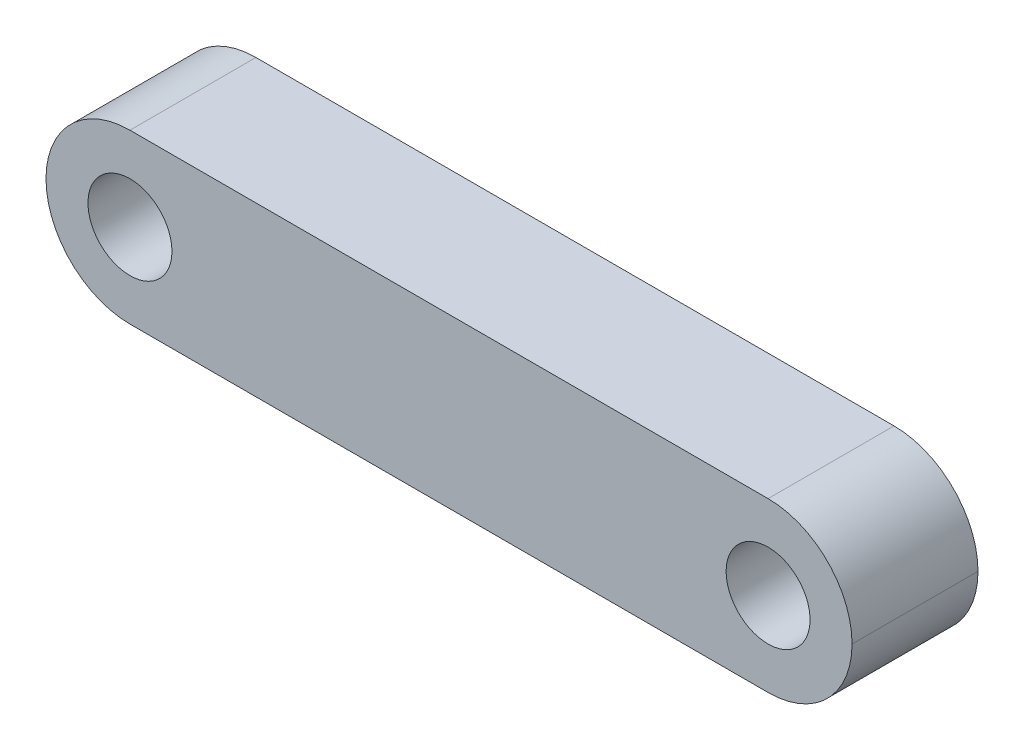
ISO-10303-21;
HEADER;
FILE_DESCRIPTION(('STEP AP214'),'2;1');
FILE_NAME('part.step','',(''),(''),'','','');
FILE_SCHEMA(('AUTOMOTIVE_DESIGN { 1 0 10303 214 1 1 1 1 }'));
ENDSEC;
DATA;
#1=APPLICATION_CONTEXT('core data for automotive mechanical design processes');
#2=APPLICATION_PROTOCOL_DEFINITION('international standard','automotive_design',2000,#1);
#3=PRODUCT_CONTEXT('',#1,'mechanical');
#4=PRODUCT('Part','Part','',(#3));
#5=PRODUCT_RELATED_PRODUCT_CATEGORY('part','',(#4));
#6=PRODUCT_DEFINITION_FORMATION('','',#4);
#7=PRODUCT_DEFINITION_CONTEXT('part definition',#1,'design');
#8=PRODUCT_DEFINITION('design','',#6,#7);
#9=PRODUCT_DEFINITION_SHAPE('','',#8);
#10=(LENGTH_UNIT() NAMED_UNIT(*) SI_UNIT(.MILLI.,.METRE.));
#11=(NAMED_UNIT(*) PLANE_ANGLE_UNIT() SI_UNIT($,.RADIAN.));
#12=(NAMED_UNIT(*) SI_UNIT($,.STERADIAN.) SOLID_ANGLE_UNIT());
#13=UNCERTAINTY_MEASURE_WITH_UNIT(LENGTH_MEASURE(1.E-05),#10,'distance_accuracy_value','');
#14=(GEOMETRIC_REPRESENTATION_CONTEXT(3) GLOBAL_UNCERTAINTY_ASSIGNED_CONTEXT((#13)) GLOBAL_UNIT_ASSIGNED_CONTEXT((#10,
#11,#12)) REPRESENTATION_CONTEXT('',''));
#15=CARTESIAN_POINT('',(0.,0.,0.));
#16=DIRECTION('',(0.,0.,1.));
#17=DIRECTION('',(1.,0.,0.));
#18=AXIS2_PLACEMENT_3D('',#15,#16,#17);
#19=CARTESIAN_POINT('',(0.,0.,15.));
#20=DIRECTION('',(0.,0.,1.));
#21=DIRECTION('',(1.,0.,0.));
#22=AXIS2_PLACEMENT_3D('',#19,#20,#21);
#23=PLANE('',#22);
#24=CARTESIAN_POINT('',(-76.,0.,15.));
#25=DIRECTION('',(0.,0.,1.));
#26=DIRECTION('',(1.,0.,0.));
#27=AXIS2_PLACEMENT_3D('',#24,#25,#26);
#28=CIRCLE('',#27,10.);
#29=CARTESIAN_POINT('',(-66.,0.,15.));
#30=VERTEX_POINT('',#29);
#31=EDGE_CURVE('E119',#30,#30,#28,.T.);
#32=ORIENTED_EDGE('',*,*,#31,.F.);
#33=EDGE_LOOP('',(#32));
#34=FACE_BOUND('',#33,.T.);
#35=CARTESIAN_POINT('',(-76.,0.,15.));
#36=DIRECTION('',(0.,0.,1.));
#37=DIRECTION('',(1.,0.,0.));
#38=AXIS2_PLACEMENT_3D('',#35,#36,#37);
#39=CIRCLE('',#38,20.);
#40=CARTESIAN_POINT('',(-76.,20.,15.));
#41=VERTEX_POINT('',#40);
#42=CARTESIAN_POINT('',(-96.,0.,15.));
#43=VERTEX_POINT('',#42);
#44=EDGE_CURVE('E49',#41,#43,#39,.T.);
#45=ORIENTED_EDGE('',*,*,#44,.T.);
#46=CARTESIAN_POINT('',(-76.,0.,15.));
#47=DIRECTION('',(0.,0.,1.));
#48=DIRECTION('',(1.,0.,0.));
#49=AXIS2_PLACEMENT_3D('',#46,#47,#48);
#50=CIRCLE('',#49,20.);
#51=CARTESIAN_POINT('',(-76.,-20.,15.));
#52=VERTEX_POINT('',#51);
#53=EDGE_CURVE('E131',#43,#52,#50,.T.);
#54=ORIENTED_EDGE('',*,*,#53,.T.);
#55=DIRECTION('',(1.,0.,0.));
#56=VECTOR('',#55,1.);
#57=CARTESIAN_POINT('',(-96.,-20.,15.));
#58=LINE('',#57,#56);
#59=CARTESIAN_POINT('',(76.,-20.,15.));
#60=VERTEX_POINT('',#59);
#61=EDGE_CURVE('E107',#52,#60,#58,.T.);
#62=ORIENTED_EDGE('',*,*,#61,.T.);
#63=CARTESIAN_POINT('',(76.,0.,15.));
#64=DIRECTION('',(0.,0.,1.));
#65=DIRECTION('',(1.,0.,0.));
#66=AXIS2_PLACEMENT_3D('',#63,#64,#65);
#67=CIRCLE('',#66,20.);
#68=CARTESIAN_POINT('',(96.,0.,15.));
#69=VERTEX_POINT('',#68);
#70=EDGE_CURVE('E128',#60,#69,#67,.T.);
#71=ORIENTED_EDGE('',*,*,#70,.T.);
#72=CARTESIAN_POINT('',(76.,0.,15.));
#73=DIRECTION('',(0.,0.,1.));
#74=DIRECTION('',(1.,0.,0.));
#75=AXIS2_PLACEMENT_3D('',#72,#73,#74);
#76=CIRCLE('',#75,20.);
#77=CARTESIAN_POINT('',(76.,20.,15.));
#78=VERTEX_POINT('',#77);
#79=EDGE_CURVE('E96',#69,#78,#76,.T.);
#80=ORIENTED_EDGE('',*,*,#79,.T.);
#81=DIRECTION('',(-1.,0.,0.));
#82=VECTOR('',#81,1.);
#83=CARTESIAN_POINT('',(-96.,20.,15.));
#84=LINE('',#83,#82);
#85=EDGE_CURVE('E115',#78,#41,#84,.T.);
#86=ORIENTED_EDGE('',*,*,#85,.T.);
#87=EDGE_LOOP('',(#45,#54,#62,#71,#80,#86));
#88=FACE_BOUND('',#87,.T.);
#89=CARTESIAN_POINT('',(76.,0.,15.));
#90=DIRECTION('',(0.,0.,1.));
#91=DIRECTION('',(-1.,0.,0.));
#92=AXIS2_PLACEMENT_3D('',#89,#90,#91);
#93=CIRCLE('',#92,10.);
#94=CARTESIAN_POINT('',(66.,0.,15.));
#95=VERTEX_POINT('',#94);
#96=EDGE_CURVE('E135',#95,#95,#93,.T.);
#97=ORIENTED_EDGE('',*,*,#96,.F.);
#98=EDGE_LOOP('',(#97));
#99=FACE_BOUND('',#98,.T.);
#100=ADVANCED_FACE('F32',(#34,#88,#99),#23,.T.);
#101=CARTESIAN_POINT('',(0.,0.,-15.));
#102=DIRECTION('',(0.,0.,1.));
#103=DIRECTION('',(1.,0.,0.));
#104=AXIS2_PLACEMENT_3D('',#101,#102,#103);
#105=PLANE('',#104);
#106=DIRECTION('',(1.,0.,0.));
#107=VECTOR('',#106,1.);
#108=CARTESIAN_POINT('',(-96.,-20.,-15.));
#109=LINE('',#108,#107);
#110=CARTESIAN_POINT('',(-76.,-20.,-15.));
#111=VERTEX_POINT('',#110);
#112=CARTESIAN_POINT('',(76.,-20.,-15.));
#113=VERTEX_POINT('',#112);
#114=EDGE_CURVE('E104',#111,#113,#109,.T.);
#115=ORIENTED_EDGE('',*,*,#114,.F.);
#116=CARTESIAN_POINT('',(-76.,0.,-15.));
#117=DIRECTION('',(0.,0.,1.));
#118=DIRECTION('',(1.,0.,0.));
#119=AXIS2_PLACEMENT_3D('',#116,#117,#118);
#120=CIRCLE('',#119,20.);
#121=CARTESIAN_POINT('',(-96.,0.,-15.));
#122=VERTEX_POINT('',#121);
#123=EDGE_CURVE('E87',#111,#122,#120,.F.);
#124=ORIENTED_EDGE('',*,*,#123,.T.);
#125=CARTESIAN_POINT('',(-76.,0.,-15.));
#126=DIRECTION('',(0.,0.,1.));
#127=DIRECTION('',(1.,0.,0.));
#128=AXIS2_PLACEMENT_3D('',#125,#126,#127);
#129=CIRCLE('',#128,20.);
#130=CARTESIAN_POINT('',(-76.,20.,-15.));
#131=VERTEX_POINT('',#130);
#132=EDGE_CURVE('E97',#122,#131,#129,.F.);
#133=ORIENTED_EDGE('',*,*,#132,.T.);
#134=DIRECTION('',(-1.,0.,0.));
#135=VECTOR('',#134,1.);
#136=CARTESIAN_POINT('',(-96.,20.,-15.));
#137=LINE('',#136,#135);
#138=CARTESIAN_POINT('',(76.,20.,-15.));
#139=VERTEX_POINT('',#138);
#140=EDGE_CURVE('E116',#139,#131,#137,.T.);
#141=ORIENTED_EDGE('',*,*,#140,.F.);
#142=CARTESIAN_POINT('',(76.,0.,-15.));
#143=DIRECTION('',(0.,0.,1.));
#144=DIRECTION('',(1.,0.,0.));
#145=AXIS2_PLACEMENT_3D('',#142,#143,#144);
#146=CIRCLE('',#145,20.);
#147=CARTESIAN_POINT('',(96.,0.,-15.));
#148=VERTEX_POINT('',#147);
#149=EDGE_CURVE('E108',#139,#148,#146,.F.);
#150=ORIENTED_EDGE('',*,*,#149,.T.);
#151=CARTESIAN_POINT('',(76.,0.,-15.));
#152=DIRECTION('',(0.,0.,1.));
#153=DIRECTION('',(1.,0.,0.));
#154=AXIS2_PLACEMENT_3D('',#151,#152,#153);
#155=CIRCLE('',#154,20.);
#156=EDGE_CURVE('E114',#148,#113,#155,.F.);
#157=ORIENTED_EDGE('',*,*,#156,.T.);
#158=EDGE_LOOP('',(#115,#124,#133,#141,#150,#157));
#159=FACE_BOUND('',#158,.T.);
#160=CARTESIAN_POINT('',(-76.,0.,-15.));
#161=DIRECTION('',(0.,0.,1.));
#162=DIRECTION('',(1.,0.,0.));
#163=AXIS2_PLACEMENT_3D('',#160,#161,#162);
#164=CIRCLE('',#163,10.);
#165=CARTESIAN_POINT('',(-66.,0.,-15.));
#166=VERTEX_POINT('',#165);
#167=EDGE_CURVE('E151',#166,#166,#164,.T.);
#168=ORIENTED_EDGE('',*,*,#167,.T.);
#169=EDGE_LOOP('',(#168));
#170=FACE_BOUND('',#169,.T.);
#171=CARTESIAN_POINT('',(76.,0.,-15.));
#172=DIRECTION('',(0.,0.,1.));
#173=DIRECTION('',(-1.,0.,0.));
#174=AXIS2_PLACEMENT_3D('',#171,#172,#173);
#175=CIRCLE('',#174,10.);
#176=CARTESIAN_POINT('',(66.,0.,-15.));
#177=VERTEX_POINT('',#176);
#178=EDGE_CURVE('E133',#177,#177,#175,.T.);
#179=ORIENTED_EDGE('',*,*,#178,.T.);
#180=EDGE_LOOP('',(#179));
#181=FACE_BOUND('',#180,.T.);
#182=ADVANCED_FACE('F111',(#159,#170,#181),#105,.F.);
#183=CARTESIAN_POINT('',(-96.,20.,15.));
#184=DIRECTION('',(0.,-1.,0.));
#185=DIRECTION('',(0.,0.,-1.));
#186=AXIS2_PLACEMENT_3D('',#183,#184,#185);
#187=PLANE('',#186);
#188=ORIENTED_EDGE('',*,*,#140,.T.);
#189=DIRECTION('',(0.,0.,-1.));
#190=VECTOR('',#189,1.);
#191=CARTESIAN_POINT('',(-76.,20.,15.));
#192=LINE('',#191,#190);
#193=EDGE_CURVE('E11',#131,#41,#192,.F.);
#194=ORIENTED_EDGE('',*,*,#193,.T.);
#195=ORIENTED_EDGE('',*,*,#85,.F.);
#196=DIRECTION('',(0.,0.,-1.));
#197=VECTOR('',#196,1.);
#198=CARTESIAN_POINT('',(76.,20.,15.));
#199=LINE('',#198,#197);
#200=EDGE_CURVE('E41',#78,#139,#199,.T.);
#201=ORIENTED_EDGE('',*,*,#200,.T.);
#202=EDGE_LOOP('',(#188,#194,#195,#201));
#203=FACE_BOUND('',#202,.T.);
#204=ADVANCED_FACE('F146',(#203),#187,.F.);
#205=CARTESIAN_POINT('',(-96.,-20.,15.));
#206=DIRECTION('',(0.,1.,0.));
#207=DIRECTION('',(0.,0.,1.));
#208=AXIS2_PLACEMENT_3D('',#205,#206,#207);
#209=PLANE('',#208);
#210=ORIENTED_EDGE('',*,*,#61,.F.);
#211=DIRECTION('',(0.,0.,-1.));
#212=VECTOR('',#211,1.);
#213=CARTESIAN_POINT('',(-76.,-20.,15.));
#214=LINE('',#213,#212);
#215=EDGE_CURVE('E91',#52,#111,#214,.T.);
#216=ORIENTED_EDGE('',*,*,#215,.T.);
#217=ORIENTED_EDGE('',*,*,#114,.T.);
#218=DIRECTION('',(0.,0.,-1.));
#219=VECTOR('',#218,1.);
#220=CARTESIAN_POINT('',(76.,-20.,15.));
#221=LINE('',#220,#219);
#222=EDGE_CURVE('E109',#113,#60,#221,.F.);
#223=ORIENTED_EDGE('',*,*,#222,.T.);
#224=EDGE_LOOP('',(#210,#216,#217,#223));
#225=FACE_BOUND('',#224,.T.);
#226=ADVANCED_FACE('F102',(#225),#209,.F.);
#227=CARTESIAN_POINT('',(-76.,0.,15.));
#228=DIRECTION('',(0.,0.,-1.));
#229=DIRECTION('',(-1.,0.,0.));
#230=AXIS2_PLACEMENT_3D('',#227,#228,#229);
#231=CYLINDRICAL_SURFACE('',#230,10.);
#232=ORIENTED_EDGE('',*,*,#31,.T.);
#233=EDGE_LOOP('',(#232));
#234=FACE_BOUND('',#233,.T.);
#235=ORIENTED_EDGE('',*,*,#167,.F.);
#236=EDGE_LOOP('',(#235));
#237=FACE_BOUND('',#236,.T.);
#238=ADVANCED_FACE('F170',(#234,#237),#231,.F.);
#239=CARTESIAN_POINT('',(76.,0.,15.));
#240=DIRECTION('',(0.,0.,-1.));
#241=DIRECTION('',(-1.,0.,0.));
#242=AXIS2_PLACEMENT_3D('',#239,#240,#241);
#243=CYLINDRICAL_SURFACE('',#242,10.);
#244=ORIENTED_EDGE('',*,*,#96,.T.);
#245=EDGE_LOOP('',(#244));
#246=FACE_BOUND('',#245,.T.);
#247=ORIENTED_EDGE('',*,*,#178,.F.);
#248=EDGE_LOOP('',(#247));
#249=FACE_BOUND('',#248,.T.);
#250=ADVANCED_FACE('F159',(#246,#249),#243,.F.);
#251=CARTESIAN_POINT('',(-76.,0.,15.));
#252=DIRECTION('',(0.,0.,-1.));
#253=DIRECTION('',(-1.,0.,0.));
#254=AXIS2_PLACEMENT_3D('',#251,#252,#253);
#255=CYLINDRICAL_SURFACE('',#254,20.);
#256=DIRECTION('',(0.,0.,-1.));
#257=VECTOR('',#256,1.);
#258=CARTESIAN_POINT('',(-96.,0.,15.));
#259=LINE('',#258,#257);
#260=EDGE_CURVE('E92',#43,#122,#259,.T.);
#261=ORIENTED_EDGE('',*,*,#260,.F.);
#262=ORIENTED_EDGE('',*,*,#44,.F.);
#263=ORIENTED_EDGE('',*,*,#193,.F.);
#264=ORIENTED_EDGE('',*,*,#132,.F.);
#265=EDGE_LOOP('',(#261,#262,#263,#264));
#266=FACE_BOUND('',#265,.T.);
#267=ADVANCED_FACE('F149',(#266),#255,.T.);
#268=CARTESIAN_POINT('',(-76.,0.,15.));
#269=DIRECTION('',(0.,0.,-1.));
#270=DIRECTION('',(-1.,0.,0.));
#271=AXIS2_PLACEMENT_3D('',#268,#269,#270);
#272=CYLINDRICAL_SURFACE('',#271,20.);
#273=ORIENTED_EDGE('',*,*,#53,.F.);
#274=ORIENTED_EDGE('',*,*,#260,.T.);
#275=ORIENTED_EDGE('',*,*,#123,.F.);
#276=ORIENTED_EDGE('',*,*,#215,.F.);
#277=EDGE_LOOP('',(#273,#274,#275,#276));
#278=FACE_BOUND('',#277,.T.);
#279=ADVANCED_FACE('F90',(#278),#272,.T.);
#280=CARTESIAN_POINT('',(76.,0.,15.));
#281=DIRECTION('',(0.,0.,-1.));
#282=DIRECTION('',(-1.,0.,0.));
#283=AXIS2_PLACEMENT_3D('',#280,#281,#282);
#284=CYLINDRICAL_SURFACE('',#283,20.);
#285=ORIENTED_EDGE('',*,*,#200,.F.);
#286=ORIENTED_EDGE('',*,*,#79,.F.);
#287=DIRECTION('',(0.,0.,-1.));
#288=VECTOR('',#287,1.);
#289=CARTESIAN_POINT('',(96.,0.,15.));
#290=LINE('',#289,#288);
#291=EDGE_CURVE('E36',#148,#69,#290,.F.);
#292=ORIENTED_EDGE('',*,*,#291,.F.);
#293=ORIENTED_EDGE('',*,*,#149,.F.);
#294=EDGE_LOOP('',(#285,#286,#292,#293));
#295=FACE_BOUND('',#294,.T.);
#296=ADVANCED_FACE('F34',(#295),#284,.T.);
#297=CARTESIAN_POINT('',(76.,0.,15.));
#298=DIRECTION('',(0.,0.,-1.));
#299=DIRECTION('',(-1.,0.,0.));
#300=AXIS2_PLACEMENT_3D('',#297,#298,#299);
#301=CYLINDRICAL_SURFACE('',#300,20.);
#302=ORIENTED_EDGE('',*,*,#70,.F.);
#303=ORIENTED_EDGE('',*,*,#222,.F.);
#304=ORIENTED_EDGE('',*,*,#156,.F.);
#305=ORIENTED_EDGE('',*,*,#291,.T.);
#306=EDGE_LOOP('',(#302,#303,#304,#305));
#307=FACE_BOUND('',#306,.T.);
#308=ADVANCED_FACE('F140',(#307),#301,.T.);
#309=CLOSED_SHELL('',(#100,#182,#204,#226,#238,#250,#267,#279,#296,#308));
#310=MANIFOLD_SOLID_BREP('B2',#309);
#311=ADVANCED_BREP_SHAPE_REPRESENTATION('',(#18,#310),#14);
#312=SHAPE_DEFINITION_REPRESENTATION(#9,#311);
ENDSEC;
END-ISO-10303-21;
